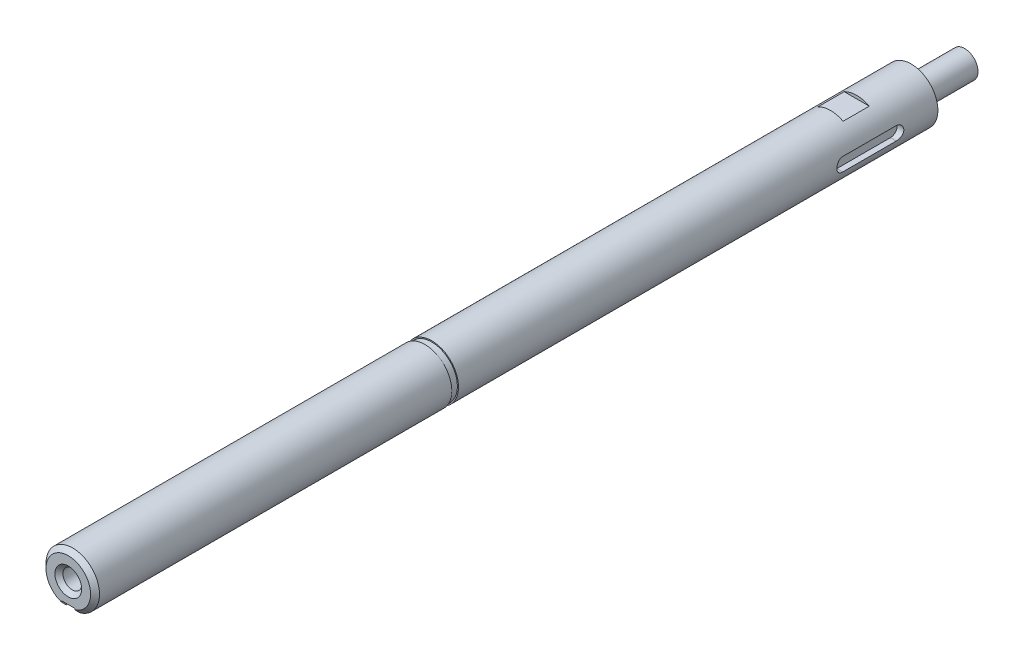
ISO-10303-21;
HEADER;
FILE_DESCRIPTION(('STEP AP214'),'2;1');
FILE_NAME('part.step','',(''),(''),'','','');
FILE_SCHEMA(('AUTOMOTIVE_DESIGN { 1 0 10303 214 1 1 1 1 }'));
ENDSEC;
DATA;
#1=APPLICATION_CONTEXT('core data for automotive mechanical design processes');
#2=APPLICATION_PROTOCOL_DEFINITION('international standard','automotive_design',2000,#1);
#3=PRODUCT_CONTEXT('',#1,'mechanical');
#4=PRODUCT('Part','Part','',(#3));
#5=PRODUCT_RELATED_PRODUCT_CATEGORY('part','',(#4));
#6=PRODUCT_DEFINITION_FORMATION('','',#4);
#7=PRODUCT_DEFINITION_CONTEXT('part definition',#1,'design');
#8=PRODUCT_DEFINITION('design','',#6,#7);
#9=PRODUCT_DEFINITION_SHAPE('','',#8);
#10=(LENGTH_UNIT() NAMED_UNIT(*) SI_UNIT(.MILLI.,.METRE.));
#11=(NAMED_UNIT(*) PLANE_ANGLE_UNIT() SI_UNIT($,.RADIAN.));
#12=(NAMED_UNIT(*) SI_UNIT($,.STERADIAN.) SOLID_ANGLE_UNIT());
#13=UNCERTAINTY_MEASURE_WITH_UNIT(LENGTH_MEASURE(1.E-05),#10,'distance_accuracy_value','');
#14=(GEOMETRIC_REPRESENTATION_CONTEXT(3) GLOBAL_UNCERTAINTY_ASSIGNED_CONTEXT((#13)) GLOBAL_UNIT_ASSIGNED_CONTEXT((#10,
#11,#12)) REPRESENTATION_CONTEXT('',''));
#15=CARTESIAN_POINT('',(0.,0.,0.));
#16=DIRECTION('',(0.,0.,1.));
#17=DIRECTION('',(1.,0.,0.));
#18=AXIS2_PLACEMENT_3D('',#15,#16,#17);
#19=CARTESIAN_POINT('',(0.,0.,38.6360747663551));
#20=DIRECTION('',(0.,0.,1.));
#21=DIRECTION('',(1.,0.,0.));
#22=AXIS2_PLACEMENT_3D('',#19,#20,#21);
#23=CYLINDRICAL_SURFACE('',#22,5.99999999999999);
#24=DIRECTION('',(0.,0.,1.));
#25=VECTOR('',#24,1.);
#26=CARTESIAN_POINT('',(-1.5,-5.80947501931112,38.6360747663551));
#27=LINE('',#26,#25);
#28=CARTESIAN_POINT('',(-1.5,-5.80947501931112,71.5));
#29=VERTEX_POINT('',#28);
#30=CARTESIAN_POINT('',(-1.5,-5.80947501931112,44.));
#31=VERTEX_POINT('',#30);
#32=EDGE_CURVE('E239',#29,#31,#27,.F.);
#33=ORIENTED_EDGE('',*,*,#32,.F.);
#34=CARTESIAN_POINT('',(0.,0.,71.5));
#35=DIRECTION('',(0.,0.,1.));
#36=DIRECTION('',(1.,0.,0.));
#37=AXIS2_PLACEMENT_3D('',#34,#35,#36);
#38=CIRCLE('',#37,5.99999999999999);
#39=CARTESIAN_POINT('',(1.5,-5.80947501931112,71.5));
#40=VERTEX_POINT('',#39);
#41=EDGE_CURVE('E246',#29,#40,#38,.F.);
#42=ORIENTED_EDGE('',*,*,#41,.T.);
#43=DIRECTION('',(0.,0.,1.));
#44=VECTOR('',#43,1.);
#45=CARTESIAN_POINT('',(1.5,-5.80947501931112,38.6360747663551));
#46=LINE('',#45,#44);
#47=CARTESIAN_POINT('',(1.5,-5.80947501931112,44.));
#48=VERTEX_POINT('',#47);
#49=EDGE_CURVE('E236',#48,#40,#46,.T.);
#50=ORIENTED_EDGE('',*,*,#49,.F.);
#51=CARTESIAN_POINT('',(1.5,-5.80947501931112,44.));
#52=CARTESIAN_POINT('',(1.50000050610781,-5.80947222799942,43.9585041849525));
#53=CARTESIAN_POINT('',(1.49827699970656,-5.80992017783168,43.9170289304314));
#54=CARTESIAN_POINT('',(1.49140639001744,-5.81168871395547,43.8343886308726));
#55=CARTESIAN_POINT('',(1.48625986320973,-5.81300915330843,43.7932235347805));
#56=CARTESIAN_POINT('',(1.46576154134062,-5.8182259958115,43.6708150470236));
#57=CARTESIAN_POINT('',(1.44535066747282,-5.8233782578672,43.5904127772672));
#58=CARTESIAN_POINT('',(1.39169752688118,-5.8364312407712,43.434314162935));
#59=CARTESIAN_POINT('',(1.35845624459234,-5.84433175075089,43.3586174578339));
#60=CARTESIAN_POINT('',(1.2801243774709,-5.86198672679341,43.2138348897242));
#61=CARTESIAN_POINT('',(1.23503026191305,-5.87174174503766,43.1447510049231));
#62=CARTESIAN_POINT('',(1.13322762282546,-5.89224377582601,43.0136851865722));
#63=CARTESIAN_POINT('',(1.07630816350678,-5.90300652212532,42.9518696054305));
#64=CARTESIAN_POINT('',(0.952915104133802,-5.92417627577148,42.8385483232416));
#65=CARTESIAN_POINT('',(0.886439695325237,-5.9345832153084,42.7870445784494));
#66=CARTESIAN_POINT('',(0.744666825245018,-5.95404548511074,42.695120446037));
#67=CARTESIAN_POINT('',(0.669257337436383,-5.96307948664407,42.6548681123477));
#68=CARTESIAN_POINT('',(0.512498621808675,-5.97858927899253,42.5876959644806));
#69=CARTESIAN_POINT('',(0.43115404089883,-5.98506704628832,42.5607658454624));
#70=CARTESIAN_POINT('',(0.291147279099772,-5.99320346467288,42.5273619597398));
#71=CARTESIAN_POINT('',(0.233407685128518,-5.9957372806662,42.5171170570585));
#72=CARTESIAN_POINT('',(0.117122246057041,-5.99914198982393,42.5034318598516));
#73=CARTESIAN_POINT('',(0.0585770054562296,-6.00001406790448,42.4999867166377));
#74=CARTESIAN_POINT('',(0.,-5.99999999999999,42.5));
#75=B_SPLINE_CURVE_WITH_KNOTS('',3,(#51,#52,#53,#54,#55,#56,#57,#58,#59,#60,#61,#62,#63,#64,#65,
#66,#67,#68,#69,#70,#71,#72,#73,#74),.UNSPECIFIED.,.F.,.F.,(4,2,2,2,2,2,2,2,2,2,2,4),(0.,
0.124408804609382,0.248796662497185,0.496844966034427,0.744874241423737,0.992977483737932,
1.24595909398059,1.49898865189714,1.75561697777792,2.01204648797967,2.18773548545528,
2.36329915947013),.UNSPECIFIED.);
#76=CARTESIAN_POINT('',(0.,-5.99999999999999,42.5));
#77=VERTEX_POINT('',#76);
#78=EDGE_CURVE('E309',#48,#77,#75,.T.);
#79=ORIENTED_EDGE('',*,*,#78,.T.);
#80=CARTESIAN_POINT('',(0.,-5.99999999999999,42.5));
#81=CARTESIAN_POINT('',(-0.0415163545926753,-6.00000236731003,42.4999995489917));
#82=CARTESIAN_POINT('',(-0.0830122173158126,-5.99956857074064,42.5017247102155));
#83=CARTESIAN_POINT('',(-0.165694903530915,-5.99785385115249,42.5086022695915));
#84=CARTESIAN_POINT('',(-0.206881774112473,-5.99657305997932,42.513754134334));
#85=CARTESIAN_POINT('',(-0.329363320912318,-5.99150741501155,42.5342755775448));
#86=CARTESIAN_POINT('',(-0.409818399988009,-5.98649900363202,42.5547113278304));
#87=CARTESIAN_POINT('',(-0.566025665932462,-5.97375719589095,42.6084368327973));
#88=CARTESIAN_POINT('',(-0.641777947365538,-5.96602385434347,42.641726328917));
#89=CARTESIAN_POINT('',(-0.786652694782805,-5.94865557635722,42.720170962628));
#90=CARTESIAN_POINT('',(-0.855773424408495,-5.93902014389672,42.7653291963344));
#91=CARTESIAN_POINT('',(-0.986799346170615,-5.91867471266243,42.8671979071887));
#92=CARTESIAN_POINT('',(-1.04854917209424,-5.9079482632477,42.9241048441014));
#93=CARTESIAN_POINT('',(-1.16174314384234,-5.88673731503211,43.0474455316589));
#94=CARTESIAN_POINT('',(-1.21318500746267,-5.87625287026521,43.1138813864518));
#95=CARTESIAN_POINT('',(-1.30504135426176,-5.85654461054657,43.2556163519978));
#96=CARTESIAN_POINT('',(-1.34527720079274,-5.84734227105564,43.3310343644925));
#97=CARTESIAN_POINT('',(-1.41241578869154,-5.83149026319508,43.4878096788007));
#98=CARTESIAN_POINT('',(-1.43932931032995,-5.8248385318885,43.5691621171767));
#99=CARTESIAN_POINT('',(-1.47268914189,-5.81647528842649,43.7091238233407));
#100=CARTESIAN_POINT('',(-1.48291436457806,-5.81386714849538,43.7668067250411));
#101=CARTESIAN_POINT('',(-1.4965742696077,-5.81035960112433,43.8829826691065));
#102=CARTESIAN_POINT('',(-1.50001339641452,-5.80945907531983,43.941475155945));
#103=CARTESIAN_POINT('',(-1.5,-5.80947501931112,44.));
#104=B_SPLINE_CURVE_WITH_KNOTS('',3,(#80,#81,#82,#83,#84,#85,#86,#87,#88,#89,#90,#91,#92,#93,
#94,#95,#96,#97,#98,#99,#100,#101,#102,#103),.UNSPECIFIED.,.F.,.F.,(4,2,2,2,2,2,2,2,2,2,2,4),
(0.,0.124470613675879,0.248921856462439,0.497115297091739,0.745303745405535,0.9935570012833,
1.24635772456625,1.49921435675913,1.75589704073026,2.01237167912656,2.18789275113833,
2.3632988297008),.UNSPECIFIED.);
#105=EDGE_CURVE('E317',#77,#31,#104,.T.);
#106=ORIENTED_EDGE('',*,*,#105,.T.);
#107=EDGE_LOOP('',(#33,#42,#50,#79,#106));
#108=FACE_BOUND('',#107,.T.);
#109=CARTESIAN_POINT('',(0.,0.,-7.50000000000003));
#110=DIRECTION('',(0.,0.,-1.));
#111=DIRECTION('',(-1.,0.,0.));
#112=AXIS2_PLACEMENT_3D('',#109,#110,#111);
#113=CIRCLE('',#112,5.99999999999999);
#114=CARTESIAN_POINT('',(-5.99999999999999,0.,-7.50000000000003));
#115=VERTEX_POINT('',#114);
#116=EDGE_CURVE('E59',#115,#115,#113,.T.);
#117=ORIENTED_EDGE('',*,*,#116,.F.);
#118=EDGE_LOOP('',(#117));
#119=FACE_BOUND('',#118,.T.);
#120=ADVANCED_FACE('F54',(#108,#119),#23,.T.);
#121=CARTESIAN_POINT('',(0.,0.,72.5));
#122=DIRECTION('',(0.,0.,1.));
#123=DIRECTION('',(1.,0.,0.));
#124=AXIS2_PLACEMENT_3D('',#121,#122,#123);
#125=PLANE('',#124);
#126=DIRECTION('',(0.,-1.,0.));
#127=VECTOR('',#126,1.);
#128=CARTESIAN_POINT('',(-1.5,-7.5,72.5));
#129=LINE('',#128,#127);
#130=CARTESIAN_POINT('',(-1.5,-4.5,72.5));
#131=VERTEX_POINT('',#130);
#132=CARTESIAN_POINT('',(-1.5,-4.76969600708476,72.5));
#133=VERTEX_POINT('',#132);
#134=EDGE_CURVE('E222',#131,#133,#129,.T.);
#135=ORIENTED_EDGE('',*,*,#134,.F.);
#136=DIRECTION('',(-1.,0.,0.));
#137=VECTOR('',#136,1.);
#138=CARTESIAN_POINT('',(-1.5,-4.5,72.5));
#139=LINE('',#138,#137);
#140=CARTESIAN_POINT('',(1.5,-4.5,72.5));
#141=VERTEX_POINT('',#140);
#142=EDGE_CURVE('E218',#141,#131,#139,.T.);
#143=ORIENTED_EDGE('',*,*,#142,.F.);
#144=DIRECTION('',(0.,1.,0.));
#145=VECTOR('',#144,1.);
#146=CARTESIAN_POINT('',(1.5,-7.5,72.5));
#147=LINE('',#146,#145);
#148=CARTESIAN_POINT('',(1.5,-4.76969600708476,72.5));
#149=VERTEX_POINT('',#148);
#150=EDGE_CURVE('E215',#149,#141,#147,.T.);
#151=ORIENTED_EDGE('',*,*,#150,.F.);
#152=CARTESIAN_POINT('',(0.,0.,72.5));
#153=DIRECTION('',(0.,0.,1.));
#154=DIRECTION('',(1.,0.,0.));
#155=AXIS2_PLACEMENT_3D('',#152,#153,#154);
#156=CIRCLE('',#155,5.00000000000003);
#157=EDGE_CURVE('E242',#149,#133,#156,.T.);
#158=ORIENTED_EDGE('',*,*,#157,.T.);
#159=EDGE_LOOP('',(#135,#143,#151,#158));
#160=FACE_BOUND('',#159,.T.);
#161=CARTESIAN_POINT('',(0.,0.,72.5));
#162=DIRECTION('',(0.,0.,1.));
#163=DIRECTION('',(1.,0.,0.));
#164=AXIS2_PLACEMENT_3D('',#161,#162,#163);
#165=CIRCLE('',#164,3.);
#166=CARTESIAN_POINT('',(3.,0.,72.5));
#167=VERTEX_POINT('',#166);
#168=EDGE_CURVE('E224',#167,#167,#165,.T.);
#169=ORIENTED_EDGE('',*,*,#168,.F.);
#170=EDGE_LOOP('',(#169));
#171=FACE_BOUND('',#170,.T.);
#172=ADVANCED_FACE('F297',(#160,#171),#125,.T.);
#173=CARTESIAN_POINT('',(-1.5,-6.001,63.9));
#174=DIRECTION('',(-1.,0.,0.));
#175=DIRECTION('',(0.,0.,1.));
#176=AXIS2_PLACEMENT_3D('',#173,#174,#175);
#177=PLANE('',#176);
#178=ORIENTED_EDGE('',*,*,#32,.T.);
#179=DIRECTION('',(0.,-1.,0.));
#180=VECTOR('',#179,1.);
#181=CARTESIAN_POINT('',(-1.5,-6.001,44.));
#182=LINE('',#181,#180);
#183=CARTESIAN_POINT('',(-1.5,-4.5,44.));
#184=VERTEX_POINT('',#183);
#185=EDGE_CURVE('E606',#31,#184,#182,.F.);
#186=ORIENTED_EDGE('',*,*,#185,.T.);
#187=DIRECTION('',(0.,0.,1.));
#188=VECTOR('',#187,1.);
#189=CARTESIAN_POINT('',(-1.5,-4.5,63.9));
#190=LINE('',#189,#188);
#191=EDGE_CURVE('E234',#184,#131,#190,.T.);
#192=ORIENTED_EDGE('',*,*,#191,.T.);
#193=ORIENTED_EDGE('',*,*,#134,.T.);
#194=CARTESIAN_POINT('',(-1.5,-3.15208903354147,74.0092027736673));
#195=CARTESIAN_POINT('',(-1.5,-3.2598087390897,73.9119130089529));
#196=CARTESIAN_POINT('',(-1.5,-3.36709123989422,73.814142230003));
#197=CARTESIAN_POINT('',(-1.5,-3.58093987315974,73.6178239204419));
#198=CARTESIAN_POINT('',(-1.5,-3.68750601900604,73.5192764044195));
#199=CARTESIAN_POINT('',(-1.5,-3.90007850181978,73.3215913586762));
#200=CARTESIAN_POINT('',(-1.5,-4.00608486750307,73.2224538597865));
#201=CARTESIAN_POINT('',(-1.5,-4.21764945654362,73.0237009146936));
#202=CARTESIAN_POINT('',(-1.5,-4.32320767746696,72.9240854659009));
#203=CARTESIAN_POINT('',(-1.5,-4.63932072349395,72.6246845564923));
#204=CARTESIAN_POINT('',(-1.5,-4.84933316606468,72.4243265781056));
#205=CARTESIAN_POINT('',(-1.5,-5.26836904962212,72.0225744400492));
#206=CARTESIAN_POINT('',(-1.5,-5.477392475195,71.8211802643318));
#207=CARTESIAN_POINT('',(-1.5,-5.89470473956583,71.4176720424537));
#208=CARTESIAN_POINT('',(-1.5,-6.10299364596639,71.2155580661747));
#209=CARTESIAN_POINT('',(-1.5,-6.51903989126007,70.8107866811726));
#210=CARTESIAN_POINT('',(-1.5,-6.72679723349977,70.6081292758874));
#211=CARTESIAN_POINT('',(-1.5,-7.14192582378493,70.2023859118114));
#212=CARTESIAN_POINT('',(-1.5,-7.34929703913829,69.9992999195852));
#213=CARTESIAN_POINT('',(-1.5,-7.76372035090361,69.5928029289025));
#214=CARTESIAN_POINT('',(-1.5,-7.97077244760827,69.3893919307444));
#215=CARTESIAN_POINT('',(-1.5,-8.177707115216,69.1858618208346));
#216=B_SPLINE_CURVE_WITH_KNOTS('',3,(#194,#195,#196,#197,#198,#199,#200,#201,#202,#203,#204,
#205,#206,#207,#208,#209,#210,#211,#212,#213,#214,#215),.UNSPECIFIED.,.F.,.F.,(4,2,2,2,2,2,2,2,
2,2,4),(0.,0.435448805322211,0.87088945141192,1.30630753874682,1.74172798786773,
2.61248995196233,3.4832654424822,4.35395858109571,5.22464622451921,6.09540450851681,
6.96616199335623),.UNSPECIFIED.);
#217=EDGE_CURVE('E256',#133,#29,#216,.T.);
#218=ORIENTED_EDGE('',*,*,#217,.T.);
#219=EDGE_LOOP('',(#178,#186,#192,#193,#218));
#220=FACE_BOUND('',#219,.T.);
#221=ADVANCED_FACE('F293',(#220),#177,.F.);
#222=CARTESIAN_POINT('',(1.5,-6.001,63.9));
#223=DIRECTION('',(1.,0.,0.));
#224=DIRECTION('',(0.,0.,-1.));
#225=AXIS2_PLACEMENT_3D('',#222,#223,#224);
#226=PLANE('',#225);
#227=DIRECTION('',(0.,0.,-1.));
#228=VECTOR('',#227,1.);
#229=CARTESIAN_POINT('',(1.5,-4.5,63.9));
#230=LINE('',#229,#228);
#231=CARTESIAN_POINT('',(1.5,-4.5,44.));
#232=VERTEX_POINT('',#231);
#233=EDGE_CURVE('E233',#141,#232,#230,.T.);
#234=ORIENTED_EDGE('',*,*,#233,.T.);
#235=DIRECTION('',(0.,1.,0.));
#236=VECTOR('',#235,1.);
#237=CARTESIAN_POINT('',(1.5,-6.001,44.));
#238=LINE('',#237,#236);
#239=EDGE_CURVE('E611',#232,#48,#238,.F.);
#240=ORIENTED_EDGE('',*,*,#239,.T.);
#241=ORIENTED_EDGE('',*,*,#49,.T.);
#242=CARTESIAN_POINT('',(1.5,-8.177707115216,69.1858618208346));
#243=CARTESIAN_POINT('',(1.5,-7.97077244760826,69.3893919307444));
#244=CARTESIAN_POINT('',(1.5,-7.76372035090361,69.5928029289025));
#245=CARTESIAN_POINT('',(1.5,-7.3492970391383,69.9992999195852));
#246=CARTESIAN_POINT('',(1.5,-7.14192582378494,70.2023859118114));
#247=CARTESIAN_POINT('',(1.5,-6.72679723349978,70.6081292758874));
#248=CARTESIAN_POINT('',(1.5,-6.51903989126008,70.8107866811725));
#249=CARTESIAN_POINT('',(1.5,-6.10299364596639,71.2155580661746));
#250=CARTESIAN_POINT('',(1.5,-5.89470473956583,71.4176720424537));
#251=CARTESIAN_POINT('',(1.5,-5.477392475195,71.8211802643318));
#252=CARTESIAN_POINT('',(1.5,-5.26836904962212,72.0225744400492));
#253=CARTESIAN_POINT('',(1.5,-4.84933316606468,72.4243265781056));
#254=CARTESIAN_POINT('',(1.5,-4.63932072349395,72.6246845564923));
#255=CARTESIAN_POINT('',(1.5,-4.32320767746696,72.9240854659009));
#256=CARTESIAN_POINT('',(1.5,-4.21764945654362,73.0237009146936));
#257=CARTESIAN_POINT('',(1.5,-4.00608486750307,73.2224538597865));
#258=CARTESIAN_POINT('',(1.5,-3.90007850181978,73.3215913586762));
#259=CARTESIAN_POINT('',(1.5,-3.68750601900604,73.5192764044195));
#260=CARTESIAN_POINT('',(1.5,-3.58093987315974,73.6178239204419));
#261=CARTESIAN_POINT('',(1.5,-3.36709123989422,73.814142230003));
#262=CARTESIAN_POINT('',(1.5,-3.2598087390897,73.9119130089529));
#263=CARTESIAN_POINT('',(1.5,-3.15208903354147,74.0092027736673));
#264=B_SPLINE_CURVE_WITH_KNOTS('',3,(#242,#243,#244,#245,#246,#247,#248,#249,#250,#251,#252,
#253,#254,#255,#256,#257,#258,#259,#260,#261,#262,#263),.UNSPECIFIED.,.F.,.F.,(4,2,2,2,2,2,2,2,
2,2,4),(0.,0.870757484839406,1.74151576883699,2.6122034122605,3.48289655087403,4.3536720413939,
5.2244340054885,5.65985445460941,6.09527254194431,6.53071318803402,6.96616199335623),.UNSPECIFIED.);
#265=EDGE_CURVE('E249',#40,#149,#264,.T.);
#266=ORIENTED_EDGE('',*,*,#265,.T.);
#267=ORIENTED_EDGE('',*,*,#150,.T.);
#268=EDGE_LOOP('',(#234,#240,#241,#266,#267));
#269=FACE_BOUND('',#268,.T.);
#270=ADVANCED_FACE('F289',(#269),#226,.F.);
#271=CARTESIAN_POINT('',(0.,-4.5,63.9));
#272=DIRECTION('',(0.,1.,0.));
#273=DIRECTION('',(0.,0.,1.));
#274=AXIS2_PLACEMENT_3D('',#271,#272,#273);
#275=PLANE('',#274);
#276=CARTESIAN_POINT('',(0.,-4.5,44.));
#277=DIRECTION('',(0.,1.,0.));
#278=DIRECTION('',(0.,0.,1.));
#279=AXIS2_PLACEMENT_3D('',#276,#277,#278);
#280=CIRCLE('',#279,1.5);
#281=CARTESIAN_POINT('',(0.,-4.5,42.5));
#282=VERTEX_POINT('',#281);
#283=EDGE_CURVE('E609',#184,#282,#280,.F.);
#284=ORIENTED_EDGE('',*,*,#283,.T.);
#285=CARTESIAN_POINT('',(0.,-4.5,44.));
#286=DIRECTION('',(0.,1.,0.));
#287=DIRECTION('',(0.,0.,1.));
#288=AXIS2_PLACEMENT_3D('',#285,#286,#287);
#289=CIRCLE('',#288,1.5);
#290=EDGE_CURVE('E613',#282,#232,#289,.F.);
#291=ORIENTED_EDGE('',*,*,#290,.T.);
#292=ORIENTED_EDGE('',*,*,#233,.F.);
#293=ORIENTED_EDGE('',*,*,#142,.T.);
#294=ORIENTED_EDGE('',*,*,#191,.F.);
#295=EDGE_LOOP('',(#284,#291,#292,#293,#294));
#296=FACE_BOUND('',#295,.T.);
#297=ADVANCED_FACE('F285',(#296),#275,.F.);
#298=CARTESIAN_POINT('',(0.,0.,58.5));
#299=DIRECTION('',(0.,0.,1.));
#300=DIRECTION('',(1.,0.,0.));
#301=AXIS2_PLACEMENT_3D('',#298,#299,#300);
#302=CONICAL_SURFACE('',#301,2.1,1.02974425867665);
#303=CARTESIAN_POINT('',(0.,0.,57.2381927000421));
#304=VERTEX_POINT('',#303);
#305=VERTEX_LOOP('',#304);
#306=FACE_BOUND('',#305,.T.);
#307=CARTESIAN_POINT('',(0.,0.,58.5));
#308=DIRECTION('',(0.,0.,1.));
#309=DIRECTION('',(1.,0.,0.));
#310=AXIS2_PLACEMENT_3D('',#307,#308,#309);
#311=CIRCLE('',#310,2.1);
#312=CARTESIAN_POINT('',(2.1,0.,58.5));
#313=VERTEX_POINT('',#312);
#314=EDGE_CURVE('E230',#313,#313,#311,.T.);
#315=ORIENTED_EDGE('',*,*,#314,.T.);
#316=EDGE_LOOP('',(#315));
#317=FACE_BOUND('',#316,.T.);
#318=ADVANCED_FACE('F281',(#306,#317),#302,.F.);
#319=CARTESIAN_POINT('',(0.,0.,72.5));
#320=DIRECTION('',(0.,0.,1.));
#321=DIRECTION('',(1.,0.,0.));
#322=AXIS2_PLACEMENT_3D('',#319,#320,#321);
#323=CYLINDRICAL_SURFACE('',#322,2.1);
#324=ORIENTED_EDGE('',*,*,#314,.F.);
#325=EDGE_LOOP('',(#324));
#326=FACE_BOUND('',#325,.T.);
#327=CARTESIAN_POINT('',(0.,0.,71.6));
#328=DIRECTION('',(0.,0.,1.));
#329=DIRECTION('',(1.,0.,0.));
#330=AXIS2_PLACEMENT_3D('',#327,#328,#329);
#331=CIRCLE('',#330,2.1);
#332=CARTESIAN_POINT('',(2.1,0.,71.6));
#333=VERTEX_POINT('',#332);
#334=EDGE_CURVE('E227',#333,#333,#331,.T.);
#335=ORIENTED_EDGE('',*,*,#334,.T.);
#336=EDGE_LOOP('',(#335));
#337=FACE_BOUND('',#336,.T.);
#338=ADVANCED_FACE('F277',(#326,#337),#323,.F.);
#339=CARTESIAN_POINT('',(0.,0.,72.5));
#340=DIRECTION('',(0.,0.,1.));
#341=DIRECTION('',(1.,0.,0.));
#342=AXIS2_PLACEMENT_3D('',#339,#340,#341);
#343=CONICAL_SURFACE('',#342,3.,0.785398163397451);
#344=ORIENTED_EDGE('',*,*,#334,.F.);
#345=EDGE_LOOP('',(#344));
#346=FACE_BOUND('',#345,.T.);
#347=ORIENTED_EDGE('',*,*,#168,.T.);
#348=EDGE_LOOP('',(#347));
#349=FACE_BOUND('',#348,.T.);
#350=ADVANCED_FACE('F274',(#346,#349),#343,.F.);
#351=CARTESIAN_POINT('',(0.,0.,72.5));
#352=DIRECTION('',(0.,0.,-1.));
#353=DIRECTION('',(-1.,0.,0.));
#354=AXIS2_PLACEMENT_3D('',#351,#352,#353);
#355=CONICAL_SURFACE('',#354,5.00000000000003,0.785398163397435);
#356=ORIENTED_EDGE('',*,*,#217,.F.);
#357=ORIENTED_EDGE('',*,*,#157,.F.);
#358=ORIENTED_EDGE('',*,*,#265,.F.);
#359=ORIENTED_EDGE('',*,*,#41,.F.);
#360=EDGE_LOOP('',(#356,#357,#358,#359));
#361=FACE_BOUND('',#360,.T.);
#362=ADVANCED_FACE('F262',(#361),#355,.T.);
#363=CARTESIAN_POINT('',(0.,0.,44.));
#364=DIRECTION('',(0.,-1.,0.));
#365=DIRECTION('',(0.,0.,-1.));
#366=AXIS2_PLACEMENT_3D('',#363,#364,#365);
#367=CYLINDRICAL_SURFACE('',#366,1.5);
#368=ORIENTED_EDGE('',*,*,#185,.F.);
#369=ORIENTED_EDGE('',*,*,#105,.F.);
#370=DIRECTION('',(0.,-1.,0.));
#371=VECTOR('',#370,1.);
#372=CARTESIAN_POINT('',(0.,0.,42.5));
#373=LINE('',#372,#371);
#374=EDGE_CURVE('E219',#282,#77,#373,.T.);
#375=ORIENTED_EDGE('',*,*,#374,.F.);
#376=ORIENTED_EDGE('',*,*,#283,.F.);
#377=EDGE_LOOP('',(#368,#369,#375,#376));
#378=FACE_BOUND('',#377,.T.);
#379=ADVANCED_FACE('F56',(#378),#367,.F.);
#380=CARTESIAN_POINT('',(0.,0.,44.));
#381=DIRECTION('',(0.,1.,0.));
#382=DIRECTION('',(0.,0.,1.));
#383=AXIS2_PLACEMENT_3D('',#380,#381,#382);
#384=CYLINDRICAL_SURFACE('',#383,1.5);
#385=ORIENTED_EDGE('',*,*,#78,.F.);
#386=ORIENTED_EDGE('',*,*,#239,.F.);
#387=ORIENTED_EDGE('',*,*,#290,.F.);
#388=ORIENTED_EDGE('',*,*,#374,.T.);
#389=EDGE_LOOP('',(#385,#386,#387,#388));
#390=FACE_BOUND('',#389,.T.);
#391=ADVANCED_FACE('F391',(#390),#384,.F.);
#392=CARTESIAN_POINT('',(0.,0.,-7.50000000000003));
#393=DIRECTION('',(0.,0.,-1.));
#394=DIRECTION('',(-1.,0.,0.));
#395=AXIS2_PLACEMENT_3D('',#392,#393,#394);
#396=PLANE('',#395);
#397=CARTESIAN_POINT('',(0.,0.,-7.50000000000002));
#398=DIRECTION('',(0.,0.,-1.));
#399=DIRECTION('',(-1.,0.,0.));
#400=AXIS2_PLACEMENT_3D('',#397,#398,#399);
#401=CIRCLE('',#400,5.75);
#402=CARTESIAN_POINT('',(-5.75,0.,-7.50000000000002));
#403=VERTEX_POINT('',#402);
#404=EDGE_CURVE('E657',#403,#403,#401,.T.);
#405=ORIENTED_EDGE('',*,*,#404,.F.);
#406=EDGE_LOOP('',(#405));
#407=FACE_BOUND('',#406,.T.);
#408=ORIENTED_EDGE('',*,*,#116,.T.);
#409=EDGE_LOOP('',(#408));
#410=FACE_BOUND('',#409,.T.);
#411=ADVANCED_FACE('F388',(#407,#410),#396,.T.);
#412=CARTESIAN_POINT('',(0.,0.,-9.00000000000003));
#413=DIRECTION('',(0.,0.,-1.));
#414=DIRECTION('',(-1.,0.,0.));
#415=AXIS2_PLACEMENT_3D('',#412,#413,#414);
#416=PLANE('',#415);
#417=CARTESIAN_POINT('',(0.,0.,-9.00000000000002));
#418=DIRECTION('',(0.,0.,-1.));
#419=DIRECTION('',(-1.,0.,0.));
#420=AXIS2_PLACEMENT_3D('',#417,#418,#419);
#421=CIRCLE('',#420,5.75);
#422=CARTESIAN_POINT('',(-5.75,0.,-9.00000000000002));
#423=VERTEX_POINT('',#422);
#424=EDGE_CURVE('E189',#423,#423,#421,.T.);
#425=ORIENTED_EDGE('',*,*,#424,.T.);
#426=EDGE_LOOP('',(#425));
#427=FACE_BOUND('',#426,.T.);
#428=CARTESIAN_POINT('',(0.,0.,-9.00000000000003));
#429=DIRECTION('',(0.,0.,-1.));
#430=DIRECTION('',(-1.,0.,0.));
#431=AXIS2_PLACEMENT_3D('',#428,#429,#430);
#432=CIRCLE('',#431,5.99999999999999);
#433=CARTESIAN_POINT('',(-5.99999999999999,0.,-9.00000000000003));
#434=VERTEX_POINT('',#433);
#435=EDGE_CURVE('E187',#434,#434,#432,.T.);
#436=ORIENTED_EDGE('',*,*,#435,.F.);
#437=EDGE_LOOP('',(#436));
#438=FACE_BOUND('',#437,.T.);
#439=ADVANCED_FACE('F390',(#427,#438),#416,.F.);
#440=CARTESIAN_POINT('',(0.,0.,-7.50000000000002));
#441=DIRECTION('',(0.,0.,-1.));
#442=DIRECTION('',(-1.,0.,0.));
#443=AXIS2_PLACEMENT_3D('',#440,#441,#442);
#444=CYLINDRICAL_SURFACE('',#443,5.75);
#445=ORIENTED_EDGE('',*,*,#404,.T.);
#446=EDGE_LOOP('',(#445));
#447=FACE_BOUND('',#446,.T.);
#448=ORIENTED_EDGE('',*,*,#424,.F.);
#449=EDGE_LOOP('',(#448));
#450=FACE_BOUND('',#449,.T.);
#451=ADVANCED_FACE('F272',(#447,#450),#444,.T.);
#452=CARTESIAN_POINT('',(0.,0.,-128.5));
#453=DIRECTION('',(0.,0.,-1.));
#454=DIRECTION('',(-1.,0.,0.));
#455=AXIS2_PLACEMENT_3D('',#452,#453,#454);
#456=PLANE('',#455);
#457=CARTESIAN_POINT('',(0.,0.,-128.5));
#458=DIRECTION('',(0.,0.,-1.));
#459=DIRECTION('',(-1.,0.,0.));
#460=AXIS2_PLACEMENT_3D('',#457,#458,#459);
#461=CIRCLE('',#460,3.);
#462=CARTESIAN_POINT('',(-3.,0.,-128.5));
#463=VERTEX_POINT('',#462);
#464=EDGE_CURVE('E206',#463,#463,#461,.T.);
#465=ORIENTED_EDGE('',*,*,#464,.T.);
#466=EDGE_LOOP('',(#465));
#467=FACE_BOUND('',#466,.T.);
#468=ADVANCED_FACE('F269',(#467),#456,.T.);
#469=CARTESIAN_POINT('',(4.5,0.,-107.365));
#470=DIRECTION('',(1.,0.,0.));
#471=DIRECTION('',(0.,0.,-1.));
#472=AXIS2_PLACEMENT_3D('',#469,#470,#471);
#473=PLANE('',#472);
#474=CARTESIAN_POINT('',(4.5,0.,-107.365));
#475=DIRECTION('',(1.,0.,0.));
#476=DIRECTION('',(0.,0.,-1.));
#477=AXIS2_PLACEMENT_3D('',#474,#475,#476);
#478=CIRCLE('',#477,1.5);
#479=CARTESIAN_POINT('',(4.5,-1.49999999999999,-107.365));
#480=VERTEX_POINT('',#479);
#481=CARTESIAN_POINT('',(4.5,1.50000000000001,-107.365));
#482=VERTEX_POINT('',#481);
#483=EDGE_CURVE('E167',#480,#482,#478,.T.);
#484=ORIENTED_EDGE('',*,*,#483,.T.);
#485=DIRECTION('',(0.,0.,1.));
#486=VECTOR('',#485,1.);
#487=CARTESIAN_POINT('',(4.5,1.50000000000001,-107.365));
#488=LINE('',#487,#486);
#489=CARTESIAN_POINT('',(4.5,1.5,-95.365));
#490=VERTEX_POINT('',#489);
#491=EDGE_CURVE('E174',#482,#490,#488,.T.);
#492=ORIENTED_EDGE('',*,*,#491,.T.);
#493=CARTESIAN_POINT('',(4.5,0.,-95.365));
#494=DIRECTION('',(1.,0.,0.));
#495=DIRECTION('',(0.,0.,-1.));
#496=AXIS2_PLACEMENT_3D('',#493,#494,#495);
#497=CIRCLE('',#496,1.5);
#498=CARTESIAN_POINT('',(4.5,-1.49999999999999,-95.365));
#499=VERTEX_POINT('',#498);
#500=EDGE_CURVE('E180',#490,#499,#497,.T.);
#501=ORIENTED_EDGE('',*,*,#500,.T.);
#502=DIRECTION('',(0.,0.,-1.));
#503=VECTOR('',#502,1.);
#504=CARTESIAN_POINT('',(4.5,-1.49999999999999,-107.365));
#505=LINE('',#504,#503);
#506=EDGE_CURVE('E184',#499,#480,#505,.T.);
#507=ORIENTED_EDGE('',*,*,#506,.T.);
#508=EDGE_LOOP('',(#484,#492,#501,#507));
#509=FACE_BOUND('',#508,.T.);
#510=ADVANCED_FACE('F183',(#509),#473,.T.);
#511=CARTESIAN_POINT('',(0.,0.,-116.5));
#512=DIRECTION('',(0.,0.,-1.));
#513=DIRECTION('',(-1.,0.,0.));
#514=AXIS2_PLACEMENT_3D('',#511,#512,#513);
#515=CYLINDRICAL_SURFACE('',#514,3.);
#516=CARTESIAN_POINT('',(0.,0.,-116.5));
#517=DIRECTION('',(0.,0.,-1.));
#518=DIRECTION('',(-1.,0.,0.));
#519=AXIS2_PLACEMENT_3D('',#516,#517,#518);
#520=CIRCLE('',#519,3.);
#521=CARTESIAN_POINT('',(-3.,0.,-116.5));
#522=VERTEX_POINT('',#521);
#523=EDGE_CURVE('E209',#522,#522,#520,.T.);
#524=ORIENTED_EDGE('',*,*,#523,.T.);
#525=EDGE_LOOP('',(#524));
#526=FACE_BOUND('',#525,.T.);
#527=ORIENTED_EDGE('',*,*,#464,.F.);
#528=EDGE_LOOP('',(#527));
#529=FACE_BOUND('',#528,.T.);
#530=ADVANCED_FACE('F371',(#526,#529),#515,.T.);
#531=CARTESIAN_POINT('',(5.99999999999999,-1.49999999999999,-107.365));
#532=DIRECTION('',(0.,1.,0.));
#533=DIRECTION('',(0.,0.,1.));
#534=AXIS2_PLACEMENT_3D('',#531,#532,#533);
#535=PLANE('',#534);
#536=DIRECTION('',(0.,0.,1.));
#537=VECTOR('',#536,1.);
#538=CARTESIAN_POINT('',(5.80947501931112,-1.50000000000001,38.6360747663551));
#539=LINE('',#538,#537);
#540=CARTESIAN_POINT('',(5.80947501931112,-1.5,-95.365));
#541=VERTEX_POINT('',#540);
#542=CARTESIAN_POINT('',(5.80947501931112,-1.49999999999999,-107.365));
#543=VERTEX_POINT('',#542);
#544=EDGE_CURVE('E64',#541,#543,#539,.F.);
#545=ORIENTED_EDGE('',*,*,#544,.T.);
#546=DIRECTION('',(-1.,0.,0.));
#547=VECTOR('',#546,1.);
#548=CARTESIAN_POINT('',(5.99999999999999,-1.49999999999999,-107.365));
#549=LINE('',#548,#547);
#550=EDGE_CURVE('E194',#543,#480,#549,.T.);
#551=ORIENTED_EDGE('',*,*,#550,.T.);
#552=ORIENTED_EDGE('',*,*,#506,.F.);
#553=DIRECTION('',(-1.,0.,0.));
#554=VECTOR('',#553,1.);
#555=CARTESIAN_POINT('',(5.99999999999999,-1.49999999999999,-95.365));
#556=LINE('',#555,#554);
#557=EDGE_CURVE('E72',#541,#499,#556,.T.);
#558=ORIENTED_EDGE('',*,*,#557,.F.);
#559=EDGE_LOOP('',(#545,#551,#552,#558));
#560=FACE_BOUND('',#559,.T.);
#561=ADVANCED_FACE('F343',(#560),#535,.T.);
#562=CARTESIAN_POINT('',(5.99999999999999,0.,-107.365));
#563=DIRECTION('',(-1.,0.,0.));
#564=DIRECTION('',(0.,0.,1.));
#565=AXIS2_PLACEMENT_3D('',#562,#563,#564);
#566=CYLINDRICAL_SURFACE('',#565,1.5);
#567=ORIENTED_EDGE('',*,*,#550,.F.);
#568=CARTESIAN_POINT('',(5.80947501931112,-1.5,-107.365));
#569=CARTESIAN_POINT('',(5.80947222870265,-1.50000050624417,-107.40649447766));
#570=CARTESIAN_POINT('',(5.80992014924206,-1.49827711106305,-107.447968394527));
#571=CARTESIAN_POINT('',(5.81168857161838,-1.49140694309363,-107.530606052955));
#572=CARTESIAN_POINT('',(5.8130089266253,-1.48626074635902,-107.571769845531));
#573=CARTESIAN_POINT('',(5.8182256645808,-1.46576285907379,-107.694179759813));
#574=CARTESIAN_POINT('',(5.82337804723212,-1.44535154275874,-107.774584702723));
#575=CARTESIAN_POINT('',(5.83643133882003,-1.391697114372,-107.930687010673));
#576=CARTESIAN_POINT('',(5.84433198946394,-1.35845520813576,-108.006384817319));
#577=CARTESIAN_POINT('',(5.86198701707908,-1.2801230670388,-108.151167172971));
#578=CARTESIAN_POINT('',(5.8717418909347,-1.2350296550354,-108.220249941836));
#579=CARTESIAN_POINT('',(5.89224393597037,-1.1332267077421,-108.351315822859));
#580=CARTESIAN_POINT('',(5.90300686543373,-1.07630590317597,-108.413132329368));
#581=CARTESIAN_POINT('',(5.9241765659429,-0.952913670774345,-108.526453134224));
#582=CARTESIAN_POINT('',(5.93458327983805,-0.886440719218244,-108.577955784202));
#583=CARTESIAN_POINT('',(5.95404273424872,-0.74468534910253,-108.669866502428));
#584=CARTESIAN_POINT('',(5.96307457022595,-0.669293010501705,-108.710109843976));
#585=CARTESIAN_POINT('',(5.97858519375882,-0.512553886264375,-108.777287101295));
#586=CARTESIAN_POINT('',(5.98506448372051,-0.431208276124513,-108.80422363645));
#587=CARTESIAN_POINT('',(5.99462850007692,-0.26661616278774,-108.843488489166));
#588=CARTESIAN_POINT('',(5.99777929351951,-0.183441483004287,-108.856101508634));
#589=CARTESIAN_POINT('',(6.00056157226223,-0.0160991635225206,-108.867255057315));
#590=CARTESIAN_POINT('',(6.00019349990166,0.0680683500430569,-108.865797355289));
#591=CARTESIAN_POINT('',(5.99602856048603,0.233028739458144,-108.849055054472));
#592=CARTESIAN_POINT('',(5.9923079801604,0.313855052609784,-108.834078075101));
#593=CARTESIAN_POINT('',(5.98194495954743,0.471808066626511,-108.791216981226));
#594=CARTESIAN_POINT('',(5.97530238998333,0.548934603635981,-108.763332295647));
#595=CARTESIAN_POINT('',(5.95972496642697,0.698110929036809,-108.695198078994));
#596=CARTESIAN_POINT('',(5.95076990741332,0.770108444403375,-108.654838908651));
#597=CARTESIAN_POINT('',(5.93153918312878,0.906414946845024,-108.56298530525));
#598=CARTESIAN_POINT('',(5.92126331899797,0.970722773343433,-108.51148919462));
#599=CARTESIAN_POINT('',(5.90018349034298,1.09165408456273,-108.397181631878));
#600=CARTESIAN_POINT('',(5.88937275716528,1.14802365458119,-108.33410254519));
#601=CARTESIAN_POINT('',(5.86869252426009,1.24945436277936,-108.199255199608));
#602=CARTESIAN_POINT('',(5.85882328264489,1.29451240536759,-108.127484570075));
#603=CARTESIAN_POINT('',(5.84111720379487,1.37220706392894,-107.976781603264));
#604=CARTESIAN_POINT('',(5.83329159013705,1.4047755268309,-107.897812802656));
#605=CARTESIAN_POINT('',(5.82070588210582,1.45605352777474,-107.735324607373));
#606=CARTESIAN_POINT('',(5.81594120642152,1.4747837838182,-107.651812217275));
#607=CARTESIAN_POINT('',(5.81182936022286,1.49085695272641,-107.533813928862));
#608=CARTESIAN_POINT('',(5.81094784666289,1.49428618645006,-107.50012044518));
#609=CARTESIAN_POINT('',(5.80977093733461,1.49885513654609,-107.432623315136));
#610=CARTESIAN_POINT('',(5.80947459329191,1.49999855714407,-107.398819936067));
#611=CARTESIAN_POINT('',(5.80947501931112,1.5,-107.365));
#612=B_SPLINE_CURVE_WITH_KNOTS('',3,(#568,#569,#570,#571,#572,#573,#574,#575,#576,#577,#578,
#579,#580,#581,#582,#583,#584,#585,#586,#587,#588,#589,#590,#591,#592,#593,#594,#595,#596,#597,
#598,#599,#600,#601,#602,#603,#604,#605,#606,#607,#608,#609,#610,#611),.UNSPECIFIED.,.F.,.F.,(4,
2,2,2,2,2,2,2,2,2,2,2,2,2,2,2,2,2,2,2,2,4),(0.,0.124404795509644,0.248788659126981,
0.496844944620475,0.744877923137238,0.992977462090117,1.24596284614196,1.49898863030879,
1.75554280647353,2.01204646098637,2.26335722272987,2.51463639384958,2.76033818218914,
3.00605084213757,3.25398764175565,3.50196181446494,3.75662144301813,4.01135068771451,
4.26745080241603,4.52316671309979,4.62473773083974,4.72614401597508),.UNSPECIFIED.);
#613=CARTESIAN_POINT('',(5.80947501931112,1.50000000000001,-107.365));
#614=VERTEX_POINT('',#613);
#615=EDGE_CURVE('E168',#543,#614,#612,.T.);
#616=ORIENTED_EDGE('',*,*,#615,.T.);
#617=DIRECTION('',(-1.,0.,0.));
#618=VECTOR('',#617,1.);
#619=CARTESIAN_POINT('',(5.99999999999999,1.50000000000001,-107.365));
#620=LINE('',#619,#618);
#621=EDGE_CURVE('E162',#614,#482,#620,.T.);
#622=ORIENTED_EDGE('',*,*,#621,.T.);
#623=ORIENTED_EDGE('',*,*,#483,.F.);
#624=EDGE_LOOP('',(#567,#616,#622,#623));
#625=FACE_BOUND('',#624,.T.);
#626=ADVANCED_FACE('F165',(#625),#566,.F.);
#627=CARTESIAN_POINT('',(5.99999999999999,1.50000000000001,-107.365));
#628=DIRECTION('',(0.,-1.,0.));
#629=DIRECTION('',(0.,0.,-1.));
#630=AXIS2_PLACEMENT_3D('',#627,#628,#629);
#631=PLANE('',#630);
#632=DIRECTION('',(0.,0.,1.));
#633=VECTOR('',#632,1.);
#634=CARTESIAN_POINT('',(5.80947501931112,1.49999999999999,38.6360747663551));
#635=LINE('',#634,#633);
#636=CARTESIAN_POINT('',(5.80947501931112,1.5,-95.365));
#637=VERTEX_POINT('',#636);
#638=EDGE_CURVE('E14',#614,#637,#635,.T.);
#639=ORIENTED_EDGE('',*,*,#638,.T.);
#640=DIRECTION('',(-1.,0.,0.));
#641=VECTOR('',#640,1.);
#642=CARTESIAN_POINT('',(5.99999999999999,1.5,-95.365));
#643=LINE('',#642,#641);
#644=EDGE_CURVE('E171',#637,#490,#643,.T.);
#645=ORIENTED_EDGE('',*,*,#644,.T.);
#646=ORIENTED_EDGE('',*,*,#491,.F.);
#647=ORIENTED_EDGE('',*,*,#621,.F.);
#648=EDGE_LOOP('',(#639,#645,#646,#647));
#649=FACE_BOUND('',#648,.T.);
#650=ADVANCED_FACE('F175',(#649),#631,.T.);
#651=CARTESIAN_POINT('',(5.99999999999999,0.,-95.365));
#652=DIRECTION('',(-1.,0.,0.));
#653=DIRECTION('',(0.,0.,1.));
#654=AXIS2_PLACEMENT_3D('',#651,#652,#653);
#655=CYLINDRICAL_SURFACE('',#654,1.5);
#656=ORIENTED_EDGE('',*,*,#644,.F.);
#657=CARTESIAN_POINT('',(5.80947501931112,1.5,-95.365));
#658=CARTESIAN_POINT('',(5.80947222870265,1.50000050624417,-95.3235055223402));
#659=CARTESIAN_POINT('',(5.80992014924206,1.49827711106305,-95.2820316054727));
#660=CARTESIAN_POINT('',(5.81168857161838,1.49140694309363,-95.1993939470447));
#661=CARTESIAN_POINT('',(5.8130089266253,1.48626074635902,-95.1582301544694));
#662=CARTESIAN_POINT('',(5.8182256645808,1.46576285907379,-95.0358202401867));
#663=CARTESIAN_POINT('',(5.82337804723213,1.44535154275874,-94.9554152972767));
#664=CARTESIAN_POINT('',(5.83643133882003,1.391697114372,-94.7993129893271));
#665=CARTESIAN_POINT('',(5.84433198946394,1.35845520813576,-94.7236151826807));
#666=CARTESIAN_POINT('',(5.86198701707908,1.2801230670388,-94.578832827029));
#667=CARTESIAN_POINT('',(5.8717418909347,1.2350296550354,-94.5097500581636));
#668=CARTESIAN_POINT('',(5.89224393597037,1.1332267077421,-94.3786841771409));
#669=CARTESIAN_POINT('',(5.90300686543373,1.07630590317596,-94.3168676706317));
#670=CARTESIAN_POINT('',(5.9241765659429,0.952913670774343,-94.2035468657759));
#671=CARTESIAN_POINT('',(5.93458327983805,0.886440719218242,-94.1520442157981));
#672=CARTESIAN_POINT('',(5.95404273424872,0.744685349102529,-94.060133497572));
#673=CARTESIAN_POINT('',(5.96307457022595,0.669293010501704,-94.019890156024));
#674=CARTESIAN_POINT('',(5.97858519375882,0.512553886264373,-93.9527128987049));
#675=CARTESIAN_POINT('',(5.98506448372051,0.431208276124511,-93.9257763635502));
#676=CARTESIAN_POINT('',(5.99462850007692,0.266616162787738,-93.8865115108339));
#677=CARTESIAN_POINT('',(5.99777929351951,0.183441483004285,-93.8738984913658));
#678=CARTESIAN_POINT('',(6.00056157226223,0.0160991635225186,-93.8627449426851));
#679=CARTESIAN_POINT('',(6.00019349990166,-0.0680683500430589,-93.8642026447115));
#680=CARTESIAN_POINT('',(5.99602856048603,-0.233028739458145,-93.8809449455282));
#681=CARTESIAN_POINT('',(5.9923079801604,-0.313855052609783,-93.8959219248992));
#682=CARTESIAN_POINT('',(5.98194495954743,-0.471808066626511,-93.9387830187741));
#683=CARTESIAN_POINT('',(5.97530238998333,-0.548934603635982,-93.9666677043529));
#684=CARTESIAN_POINT('',(5.95972496642697,-0.698110929036811,-94.034801921006));
#685=CARTESIAN_POINT('',(5.95076990741332,-0.770108444403377,-94.0751610913493));
#686=CARTESIAN_POINT('',(5.93153918312878,-0.906414946845026,-94.1670146947502));
#687=CARTESIAN_POINT('',(5.92126331899797,-0.970722773343436,-94.2185108053798));
#688=CARTESIAN_POINT('',(5.90018349034298,-1.09165408456274,-94.332818368122));
#689=CARTESIAN_POINT('',(5.88937275716527,-1.1480236545812,-94.3958974548097));
#690=CARTESIAN_POINT('',(5.86869252426009,-1.24945436277936,-94.5307448003916));
#691=CARTESIAN_POINT('',(5.85882328264489,-1.2945124053676,-94.6025154299253));
#692=CARTESIAN_POINT('',(5.84111720379487,-1.37220706392894,-94.7532183967356));
#693=CARTESIAN_POINT('',(5.83329159013705,-1.4047755268309,-94.8321871973441));
#694=CARTESIAN_POINT('',(5.82070588210582,-1.45605352777474,-94.9946753926274));
#695=CARTESIAN_POINT('',(5.81594120642152,-1.4747837838182,-95.0781877827248));
#696=CARTESIAN_POINT('',(5.81182936022286,-1.49085695272641,-95.1961860711384));
#697=CARTESIAN_POINT('',(5.81094784666289,-1.49428618645006,-95.2298795548198));
#698=CARTESIAN_POINT('',(5.80977093733461,-1.49885513654609,-95.297376684864));
#699=CARTESIAN_POINT('',(5.80947459329191,-1.49999855714407,-95.3311800639329));
#700=CARTESIAN_POINT('',(5.80947501931112,-1.5,-95.365));
#701=B_SPLINE_CURVE_WITH_KNOTS('',3,(#657,#658,#659,#660,#661,#662,#663,#664,#665,#666,#667,
#668,#669,#670,#671,#672,#673,#674,#675,#676,#677,#678,#679,#680,#681,#682,#683,#684,#685,#686,
#687,#688,#689,#690,#691,#692,#693,#694,#695,#696,#697,#698,#699,#700),.UNSPECIFIED.,.F.,.F.,(4,
2,2,2,2,2,2,2,2,2,2,2,2,2,2,2,2,2,2,2,2,4),(0.,0.124404795509644,0.248788659126981,
0.496844944620475,0.744877923137238,0.992977462090116,1.24596284614196,1.49898863030879,
1.75554280647353,2.01204646098637,2.26335722272987,2.51463639384958,2.76033818218913,
3.00605084213757,3.25398764175565,3.50196181446494,3.75662144301814,4.0113506877145,
4.26745080241601,4.52316671309979,4.62473773083973,4.72614401597507),.UNSPECIFIED.);
#702=EDGE_CURVE('E323',#637,#541,#701,.T.);
#703=ORIENTED_EDGE('',*,*,#702,.T.);
#704=ORIENTED_EDGE('',*,*,#557,.T.);
#705=ORIENTED_EDGE('',*,*,#500,.F.);
#706=EDGE_LOOP('',(#656,#703,#704,#705));
#707=FACE_BOUND('',#706,.T.);
#708=ADVANCED_FACE('F336',(#707),#655,.F.);
#709=CARTESIAN_POINT('',(0.,0.,-116.5));
#710=DIRECTION('',(0.,0.,-1.));
#711=DIRECTION('',(-1.,0.,0.));
#712=AXIS2_PLACEMENT_3D('',#709,#710,#711);
#713=PLANE('',#712);
#714=ORIENTED_EDGE('',*,*,#523,.F.);
#715=EDGE_LOOP('',(#714));
#716=FACE_BOUND('',#715,.T.);
#717=CARTESIAN_POINT('',(0.,0.,-116.5));
#718=DIRECTION('',(0.,0.,-1.));
#719=DIRECTION('',(-1.,0.,0.));
#720=AXIS2_PLACEMENT_3D('',#717,#718,#719);
#721=CIRCLE('',#720,5.99999999999999);
#722=CARTESIAN_POINT('',(-5.99999999999999,0.,-116.5));
#723=VERTEX_POINT('',#722);
#724=EDGE_CURVE('E212',#723,#723,#721,.T.);
#725=ORIENTED_EDGE('',*,*,#724,.T.);
#726=EDGE_LOOP('',(#725));
#727=FACE_BOUND('',#726,.T.);
#728=ADVANCED_FACE('F341',(#716,#727),#713,.T.);
#729=CARTESIAN_POINT('',(-5.99999999999999,-28.119621356836,-104.3));
#730=DIRECTION('',(0.,0.,-1.));
#731=DIRECTION('',(-1.,0.,0.));
#732=AXIS2_PLACEMENT_3D('',#729,#730,#731);
#733=PLANE('',#732);
#734=DIRECTION('',(1.,0.,0.));
#735=VECTOR('',#734,1.);
#736=CARTESIAN_POINT('',(-5.99999999999999,-5.3,-104.3));
#737=LINE('',#736,#735);
#738=CARTESIAN_POINT('',(-2.81247222208503,-5.3,-104.3));
#739=VERTEX_POINT('',#738);
#740=CARTESIAN_POINT('',(2.81247222208503,-5.3,-104.3));
#741=VERTEX_POINT('',#740);
#742=EDGE_CURVE('E201',#739,#741,#737,.T.);
#743=ORIENTED_EDGE('',*,*,#742,.F.);
#744=CARTESIAN_POINT('',(0.,0.,-104.3));
#745=DIRECTION('',(0.,0.,-1.));
#746=DIRECTION('',(-1.,0.,0.));
#747=AXIS2_PLACEMENT_3D('',#744,#745,#746);
#748=CIRCLE('',#747,5.99999999999999);
#749=EDGE_CURVE('E628',#741,#739,#748,.T.);
#750=ORIENTED_EDGE('',*,*,#749,.F.);
#751=EDGE_LOOP('',(#743,#750));
#752=FACE_BOUND('',#751,.T.);
#753=ADVANCED_FACE('F363',(#752),#733,.F.);
#754=CARTESIAN_POINT('',(-5.99999999999999,-28.119621356836,-98.43));
#755=DIRECTION('',(0.,0.,1.));
#756=DIRECTION('',(1.,0.,0.));
#757=AXIS2_PLACEMENT_3D('',#754,#755,#756);
#758=PLANE('',#757);
#759=DIRECTION('',(1.,0.,0.));
#760=VECTOR('',#759,1.);
#761=CARTESIAN_POINT('',(-5.99999999999999,-5.3,-98.43));
#762=LINE('',#761,#760);
#763=CARTESIAN_POINT('',(-2.81247222208507,-5.3,-98.43));
#764=VERTEX_POINT('',#763);
#765=CARTESIAN_POINT('',(2.81247222208507,-5.3,-98.43));
#766=VERTEX_POINT('',#765);
#767=EDGE_CURVE('E203',#764,#766,#762,.T.);
#768=ORIENTED_EDGE('',*,*,#767,.T.);
#769=CARTESIAN_POINT('',(0.,0.,-98.43));
#770=DIRECTION('',(0.,0.,1.));
#771=DIRECTION('',(1.,0.,0.));
#772=AXIS2_PLACEMENT_3D('',#769,#770,#771);
#773=CIRCLE('',#772,5.99999999999999);
#774=EDGE_CURVE('E637',#764,#766,#773,.T.);
#775=ORIENTED_EDGE('',*,*,#774,.F.);
#776=EDGE_LOOP('',(#768,#775));
#777=FACE_BOUND('',#776,.T.);
#778=ADVANCED_FACE('F360',(#777),#758,.F.);
#779=CARTESIAN_POINT('',(-5.99999999999999,-5.3,-104.3));
#780=DIRECTION('',(0.,1.,0.));
#781=DIRECTION('',(0.,0.,1.));
#782=AXIS2_PLACEMENT_3D('',#779,#780,#781);
#783=PLANE('',#782);
#784=ORIENTED_EDGE('',*,*,#742,.T.);
#785=DIRECTION('',(0.,0.,1.));
#786=VECTOR('',#785,1.);
#787=CARTESIAN_POINT('',(2.81247222208507,-5.29999999999998,38.6360747663551));
#788=LINE('',#787,#786);
#789=EDGE_CURVE('E631',#766,#741,#788,.F.);
#790=ORIENTED_EDGE('',*,*,#789,.F.);
#791=ORIENTED_EDGE('',*,*,#767,.F.);
#792=DIRECTION('',(0.,0.,1.));
#793=VECTOR('',#792,1.);
#794=CARTESIAN_POINT('',(-2.81247222208507,-5.29999999999998,38.6360747663551));
#795=LINE('',#794,#793);
#796=EDGE_CURVE('E634',#739,#764,#795,.T.);
#797=ORIENTED_EDGE('',*,*,#796,.F.);
#798=EDGE_LOOP('',(#784,#790,#791,#797));
#799=FACE_BOUND('',#798,.T.);
#800=ADVANCED_FACE('F359',(#799),#783,.F.);
#801=CARTESIAN_POINT('',(-5.99999999999999,28.1555202710572,-98.43));
#802=DIRECTION('',(0.,0.,1.));
#803=DIRECTION('',(1.,0.,0.));
#804=AXIS2_PLACEMENT_3D('',#801,#802,#803);
#805=PLANE('',#804);
#806=DIRECTION('',(1.,0.,0.));
#807=VECTOR('',#806,1.);
#808=CARTESIAN_POINT('',(-5.99999999999999,5.3,-98.43));
#809=LINE('',#808,#807);
#810=CARTESIAN_POINT('',(-2.81247222208503,5.3,-98.43));
#811=VERTEX_POINT('',#810);
#812=CARTESIAN_POINT('',(2.81247222208503,5.3,-98.43));
#813=VERTEX_POINT('',#812);
#814=EDGE_CURVE('E79',#811,#813,#809,.T.);
#815=ORIENTED_EDGE('',*,*,#814,.F.);
#816=CARTESIAN_POINT('',(0.,0.,-98.43));
#817=DIRECTION('',(0.,0.,1.));
#818=DIRECTION('',(1.,0.,0.));
#819=AXIS2_PLACEMENT_3D('',#816,#817,#818);
#820=CIRCLE('',#819,5.99999999999999);
#821=EDGE_CURVE('E640',#813,#811,#820,.T.);
#822=ORIENTED_EDGE('',*,*,#821,.F.);
#823=EDGE_LOOP('',(#815,#822));
#824=FACE_BOUND('',#823,.T.);
#825=ADVANCED_FACE('F352',(#824),#805,.F.);
#826=CARTESIAN_POINT('',(-5.99999999999999,28.1555202710572,-104.3));
#827=DIRECTION('',(0.,0.,-1.));
#828=DIRECTION('',(-1.,0.,0.));
#829=AXIS2_PLACEMENT_3D('',#826,#827,#828);
#830=PLANE('',#829);
#831=DIRECTION('',(1.,0.,0.));
#832=VECTOR('',#831,1.);
#833=CARTESIAN_POINT('',(-5.99999999999999,5.3,-104.3));
#834=LINE('',#833,#832);
#835=CARTESIAN_POINT('',(-2.81247222208507,5.3,-104.3));
#836=VERTEX_POINT('',#835);
#837=CARTESIAN_POINT('',(2.81247222208507,5.3,-104.3));
#838=VERTEX_POINT('',#837);
#839=EDGE_CURVE('E198',#836,#838,#834,.T.);
#840=ORIENTED_EDGE('',*,*,#839,.T.);
#841=CARTESIAN_POINT('',(0.,0.,-104.3));
#842=DIRECTION('',(0.,0.,-1.));
#843=DIRECTION('',(-1.,0.,0.));
#844=AXIS2_PLACEMENT_3D('',#841,#842,#843);
#845=CIRCLE('',#844,5.99999999999999);
#846=EDGE_CURVE('E329',#836,#838,#845,.T.);
#847=ORIENTED_EDGE('',*,*,#846,.F.);
#848=EDGE_LOOP('',(#840,#847));
#849=FACE_BOUND('',#848,.T.);
#850=ADVANCED_FACE('F349',(#849),#830,.F.);
#851=CARTESIAN_POINT('',(-5.99999999999999,5.3,-104.3));
#852=DIRECTION('',(0.,-1.,0.));
#853=DIRECTION('',(0.,0.,-1.));
#854=AXIS2_PLACEMENT_3D('',#851,#852,#853);
#855=PLANE('',#854);
#856=ORIENTED_EDGE('',*,*,#839,.F.);
#857=DIRECTION('',(0.,0.,1.));
#858=VECTOR('',#857,1.);
#859=CARTESIAN_POINT('',(-2.81247222208507,5.29999999999998,38.6360747663551));
#860=LINE('',#859,#858);
#861=EDGE_CURVE('E643',#811,#836,#860,.F.);
#862=ORIENTED_EDGE('',*,*,#861,.F.);
#863=ORIENTED_EDGE('',*,*,#814,.T.);
#864=DIRECTION('',(0.,0.,1.));
#865=VECTOR('',#864,1.);
#866=CARTESIAN_POINT('',(2.81247222208507,5.29999999999998,38.6360747663551));
#867=LINE('',#866,#865);
#868=EDGE_CURVE('E645',#838,#813,#867,.T.);
#869=ORIENTED_EDGE('',*,*,#868,.F.);
#870=EDGE_LOOP('',(#856,#862,#863,#869));
#871=FACE_BOUND('',#870,.T.);
#872=ADVANCED_FACE('F304',(#871),#855,.F.);
#873=ORIENTED_EDGE('',*,*,#435,.T.);
#874=EDGE_LOOP('',(#873));
#875=FACE_BOUND('',#874,.T.);
#876=ORIENTED_EDGE('',*,*,#861,.T.);
#877=ORIENTED_EDGE('',*,*,#846,.T.);
#878=ORIENTED_EDGE('',*,*,#868,.T.);
#879=ORIENTED_EDGE('',*,*,#821,.T.);
#880=EDGE_LOOP('',(#876,#877,#878,#879));
#881=FACE_BOUND('',#880,.T.);
#882=ORIENTED_EDGE('',*,*,#796,.T.);
#883=ORIENTED_EDGE('',*,*,#774,.T.);
#884=ORIENTED_EDGE('',*,*,#789,.T.);
#885=ORIENTED_EDGE('',*,*,#749,.T.);
#886=EDGE_LOOP('',(#882,#883,#884,#885));
#887=FACE_BOUND('',#886,.T.);
#888=ORIENTED_EDGE('',*,*,#724,.F.);
#889=EDGE_LOOP('',(#888));
#890=FACE_BOUND('',#889,.T.);
#891=ORIENTED_EDGE('',*,*,#702,.F.);
#892=ORIENTED_EDGE('',*,*,#638,.F.);
#893=ORIENTED_EDGE('',*,*,#615,.F.);
#894=ORIENTED_EDGE('',*,*,#544,.F.);
#895=EDGE_LOOP('',(#891,#892,#893,#894));
#896=FACE_BOUND('',#895,.T.);
#897=ADVANCED_FACE('F301',(#875,#881,#887,#890,#896),#23,.T.);
#898=CLOSED_SHELL('',(#120,#172,#221,#270,#297,#318,#338,#350,#362,#379,#391,#411,#439,#451,
#468,#510,#530,#561,#626,#650,#708,#728,#753,#778,#800,#825,#850,#872,#897));
#899=MANIFOLD_SOLID_BREP('B2',#898);
#900=ADVANCED_BREP_SHAPE_REPRESENTATION('',(#18,#899),#14);
#901=SHAPE_DEFINITION_REPRESENTATION(#9,#900);
ENDSEC;
END-ISO-10303-21;
